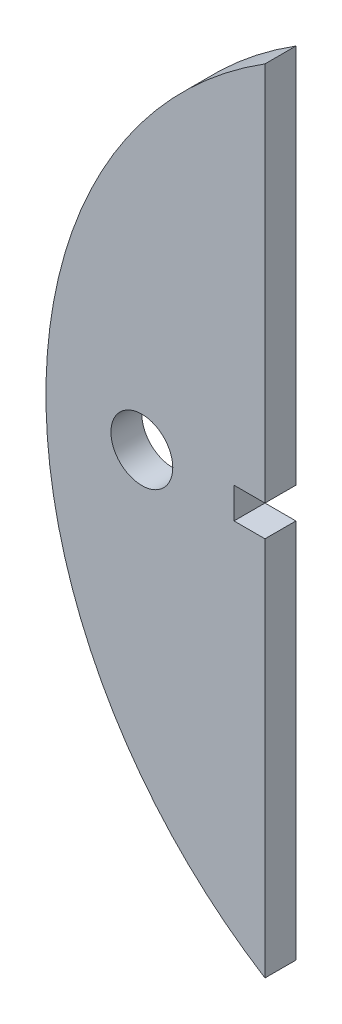
ISO-10303-21;
HEADER;
FILE_DESCRIPTION(('STEP AP214'),'2;1');
FILE_NAME('part.step','',(''),(''),'','','');
FILE_SCHEMA(('AUTOMOTIVE_DESIGN { 1 0 10303 214 1 1 1 1 }'));
ENDSEC;
DATA;
#1=APPLICATION_CONTEXT('core data for automotive mechanical design processes');
#2=APPLICATION_PROTOCOL_DEFINITION('international standard','automotive_design',2000,#1);
#3=PRODUCT_CONTEXT('',#1,'mechanical');
#4=PRODUCT('Part','Part','',(#3));
#5=PRODUCT_RELATED_PRODUCT_CATEGORY('part','',(#4));
#6=PRODUCT_DEFINITION_FORMATION('','',#4);
#7=PRODUCT_DEFINITION_CONTEXT('part definition',#1,'design');
#8=PRODUCT_DEFINITION('design','',#6,#7);
#9=PRODUCT_DEFINITION_SHAPE('','',#8);
#10=(LENGTH_UNIT() NAMED_UNIT(*) SI_UNIT(.MILLI.,.METRE.));
#11=(NAMED_UNIT(*) PLANE_ANGLE_UNIT() SI_UNIT($,.RADIAN.));
#12=(NAMED_UNIT(*) SI_UNIT($,.STERADIAN.) SOLID_ANGLE_UNIT());
#13=UNCERTAINTY_MEASURE_WITH_UNIT(LENGTH_MEASURE(1.E-05),#10,'distance_accuracy_value','');
#14=(GEOMETRIC_REPRESENTATION_CONTEXT(3) GLOBAL_UNCERTAINTY_ASSIGNED_CONTEXT((#13)) GLOBAL_UNIT_ASSIGNED_CONTEXT((#10,
#11,#12)) REPRESENTATION_CONTEXT('',''));
#15=CARTESIAN_POINT('',(0.,0.,0.));
#16=DIRECTION('',(0.,0.,1.));
#17=DIRECTION('',(1.,0.,0.));
#18=AXIS2_PLACEMENT_3D('',#15,#16,#17);
#19=CARTESIAN_POINT('',(0.,0.,3.175));
#20=DIRECTION('',(0.,0.,1.));
#21=DIRECTION('',(1.,0.,0.));
#22=AXIS2_PLACEMENT_3D('',#19,#20,#21);
#23=PLANE('',#22);
#24=DIRECTION('',(0.,1.,0.));
#25=VECTOR('',#24,1.);
#26=CARTESIAN_POINT('',(-28.6385,1.5875,3.175));
#27=LINE('',#26,#25);
#28=CARTESIAN_POINT('',(-28.6385,-1.58749999999999,3.175));
#29=VERTEX_POINT('',#28);
#30=CARTESIAN_POINT('',(-28.6385,1.5875,3.175));
#31=VERTEX_POINT('',#30);
#32=EDGE_CURVE('E128',#29,#31,#27,.T.);
#33=ORIENTED_EDGE('',*,*,#32,.T.);
#34=DIRECTION('',(1.,0.,0.));
#35=VECTOR('',#34,1.);
#36=CARTESIAN_POINT('',(-28.6385,1.5875,3.175));
#37=LINE('',#36,#35);
#38=CARTESIAN_POINT('',(-25.4635,1.5875,3.175));
#39=VERTEX_POINT('',#38);
#40=EDGE_CURVE('E86',#31,#39,#37,.T.);
#41=ORIENTED_EDGE('',*,*,#40,.T.);
#42=DIRECTION('',(0.,1.,0.));
#43=VECTOR('',#42,1.);
#44=CARTESIAN_POINT('',(-25.4635,1.5875,3.175));
#45=LINE('',#44,#43);
#46=CARTESIAN_POINT('',(-25.4635,40.6213425922876,3.175));
#47=VERTEX_POINT('',#46);
#48=EDGE_CURVE('E99',#39,#47,#45,.T.);
#49=ORIENTED_EDGE('',*,*,#48,.T.);
#50=CARTESIAN_POINT('',(0.,0.,3.175));
#51=DIRECTION('',(0.,0.,1.));
#52=DIRECTION('',(1.,0.,0.));
#53=AXIS2_PLACEMENT_3D('',#50,#51,#52);
#54=CIRCLE('',#53,47.9425);
#55=CARTESIAN_POINT('',(-25.4635,-40.6213425922876,3.175));
#56=VERTEX_POINT('',#55);
#57=EDGE_CURVE('E93',#47,#56,#54,.T.);
#58=ORIENTED_EDGE('',*,*,#57,.T.);
#59=DIRECTION('',(0.,1.,0.));
#60=VECTOR('',#59,1.);
#61=CARTESIAN_POINT('',(-25.4635,-1.5875,3.175));
#62=LINE('',#61,#60);
#63=CARTESIAN_POINT('',(-25.4635,-1.5875,3.175));
#64=VERTEX_POINT('',#63);
#65=EDGE_CURVE('E97',#56,#64,#62,.T.);
#66=ORIENTED_EDGE('',*,*,#65,.T.);
#67=DIRECTION('',(-1.,0.,0.));
#68=VECTOR('',#67,1.);
#69=CARTESIAN_POINT('',(-28.6385,-1.58749999999999,3.175));
#70=LINE('',#69,#68);
#71=EDGE_CURVE('E49',#64,#29,#70,.T.);
#72=ORIENTED_EDGE('',*,*,#71,.T.);
#73=EDGE_LOOP('',(#33,#41,#49,#58,#66,#72));
#74=FACE_BOUND('',#73,.T.);
#75=CARTESIAN_POINT('',(-38.1,0.,3.175));
#76=DIRECTION('',(0.,0.,1.));
#77=DIRECTION('',(1.,0.,0.));
#78=AXIS2_PLACEMENT_3D('',#75,#76,#77);
#79=CIRCLE('',#78,3.175);
#80=CARTESIAN_POINT('',(-34.925,0.,3.175));
#81=VERTEX_POINT('',#80);
#82=EDGE_CURVE('E121',#81,#81,#79,.T.);
#83=ORIENTED_EDGE('',*,*,#82,.F.);
#84=EDGE_LOOP('',(#83));
#85=FACE_BOUND('',#84,.T.);
#86=ADVANCED_FACE('F32',(#74,#85),#23,.T.);
#87=CARTESIAN_POINT('',(0.,0.,0.));
#88=DIRECTION('',(0.,0.,1.));
#89=DIRECTION('',(1.,0.,0.));
#90=AXIS2_PLACEMENT_3D('',#87,#88,#89);
#91=PLANE('',#90);
#92=DIRECTION('',(0.,1.,0.));
#93=VECTOR('',#92,1.);
#94=CARTESIAN_POINT('',(-28.6385,1.5875,0.));
#95=LINE('',#94,#93);
#96=CARTESIAN_POINT('',(-28.6385,-1.58749999999999,0.));
#97=VERTEX_POINT('',#96);
#98=CARTESIAN_POINT('',(-28.6385,1.5875,0.));
#99=VERTEX_POINT('',#98);
#100=EDGE_CURVE('E117',#97,#99,#95,.T.);
#101=ORIENTED_EDGE('',*,*,#100,.F.);
#102=DIRECTION('',(-1.,0.,0.));
#103=VECTOR('',#102,1.);
#104=CARTESIAN_POINT('',(-28.6385,-1.58749999999999,0.));
#105=LINE('',#104,#103);
#106=CARTESIAN_POINT('',(-25.4635,-1.5875,0.));
#107=VERTEX_POINT('',#106);
#108=EDGE_CURVE('E78',#107,#97,#105,.T.);
#109=ORIENTED_EDGE('',*,*,#108,.F.);
#110=DIRECTION('',(0.,1.,0.));
#111=VECTOR('',#110,1.);
#112=CARTESIAN_POINT('',(-25.4635,-1.5875,0.));
#113=LINE('',#112,#111);
#114=CARTESIAN_POINT('',(-25.4635,-40.6213425922876,0.));
#115=VERTEX_POINT('',#114);
#116=EDGE_CURVE('E72',#115,#107,#113,.T.);
#117=ORIENTED_EDGE('',*,*,#116,.F.);
#118=CARTESIAN_POINT('',(0.,0.,0.));
#119=DIRECTION('',(0.,0.,1.));
#120=DIRECTION('',(1.,0.,0.));
#121=AXIS2_PLACEMENT_3D('',#118,#119,#120);
#122=CIRCLE('',#121,47.9425);
#123=CARTESIAN_POINT('',(-25.4635,40.6213425922876,0.));
#124=VERTEX_POINT('',#123);
#125=EDGE_CURVE('E107',#124,#115,#122,.T.);
#126=ORIENTED_EDGE('',*,*,#125,.F.);
#127=DIRECTION('',(0.,1.,0.));
#128=VECTOR('',#127,1.);
#129=CARTESIAN_POINT('',(-25.4635,1.5875,0.));
#130=LINE('',#129,#128);
#131=CARTESIAN_POINT('',(-25.4635,1.5875,0.));
#132=VERTEX_POINT('',#131);
#133=EDGE_CURVE('E123',#132,#124,#130,.T.);
#134=ORIENTED_EDGE('',*,*,#133,.F.);
#135=DIRECTION('',(1.,0.,0.));
#136=VECTOR('',#135,1.);
#137=CARTESIAN_POINT('',(-28.6385,1.5875,0.));
#138=LINE('',#137,#136);
#139=EDGE_CURVE('E120',#99,#132,#138,.T.);
#140=ORIENTED_EDGE('',*,*,#139,.F.);
#141=EDGE_LOOP('',(#101,#109,#117,#126,#134,#140));
#142=FACE_BOUND('',#141,.T.);
#143=CARTESIAN_POINT('',(-38.1,0.,0.));
#144=DIRECTION('',(0.,0.,1.));
#145=DIRECTION('',(1.,0.,0.));
#146=AXIS2_PLACEMENT_3D('',#143,#144,#145);
#147=CIRCLE('',#146,3.175);
#148=CARTESIAN_POINT('',(-34.925,0.,0.));
#149=VERTEX_POINT('',#148);
#150=EDGE_CURVE('E221',#149,#149,#147,.T.);
#151=ORIENTED_EDGE('',*,*,#150,.T.);
#152=EDGE_LOOP('',(#151));
#153=FACE_BOUND('',#152,.T.);
#154=ADVANCED_FACE('F137',(#142,#153),#91,.F.);
#155=CARTESIAN_POINT('',(-28.6385,1.5875,3.175));
#156=DIRECTION('',(-1.,0.,0.));
#157=DIRECTION('',(0.,0.,1.));
#158=AXIS2_PLACEMENT_3D('',#155,#156,#157);
#159=PLANE('',#158);
#160=ORIENTED_EDGE('',*,*,#100,.T.);
#161=DIRECTION('',(0.,0.,-1.));
#162=VECTOR('',#161,1.);
#163=CARTESIAN_POINT('',(-28.6385,1.5875,3.175));
#164=LINE('',#163,#162);
#165=EDGE_CURVE('E11',#31,#99,#164,.T.);
#166=ORIENTED_EDGE('',*,*,#165,.F.);
#167=ORIENTED_EDGE('',*,*,#32,.F.);
#168=DIRECTION('',(0.,0.,-1.));
#169=VECTOR('',#168,1.);
#170=CARTESIAN_POINT('',(-28.6385,-1.58749999999999,3.175));
#171=LINE('',#170,#169);
#172=EDGE_CURVE('E113',#29,#97,#171,.T.);
#173=ORIENTED_EDGE('',*,*,#172,.T.);
#174=EDGE_LOOP('',(#160,#166,#167,#173));
#175=FACE_BOUND('',#174,.T.);
#176=ADVANCED_FACE('F34',(#175),#159,.F.);
#177=CARTESIAN_POINT('',(-28.6385,1.5875,3.175));
#178=DIRECTION('',(0.,1.,0.));
#179=DIRECTION('',(-1.,0.,0.));
#180=AXIS2_PLACEMENT_3D('',#177,#178,#179);
#181=PLANE('',#180);
#182=ORIENTED_EDGE('',*,*,#139,.T.);
#183=DIRECTION('',(0.,0.,-1.));
#184=VECTOR('',#183,1.);
#185=CARTESIAN_POINT('',(-25.4635,1.5875,3.175));
#186=LINE('',#185,#184);
#187=EDGE_CURVE('E41',#39,#132,#186,.T.);
#188=ORIENTED_EDGE('',*,*,#187,.F.);
#189=ORIENTED_EDGE('',*,*,#40,.F.);
#190=ORIENTED_EDGE('',*,*,#165,.T.);
#191=EDGE_LOOP('',(#182,#188,#189,#190));
#192=FACE_BOUND('',#191,.T.);
#193=ADVANCED_FACE('F162',(#192),#181,.F.);
#194=CARTESIAN_POINT('',(-25.4635,1.5875,3.175));
#195=DIRECTION('',(-1.,0.,0.));
#196=DIRECTION('',(0.,0.,1.));
#197=AXIS2_PLACEMENT_3D('',#194,#195,#196);
#198=PLANE('',#197);
#199=ORIENTED_EDGE('',*,*,#133,.T.);
#200=DIRECTION('',(0.,0.,-1.));
#201=VECTOR('',#200,1.);
#202=CARTESIAN_POINT('',(-25.4635,40.6213425922876,3.175));
#203=LINE('',#202,#201);
#204=EDGE_CURVE('E108',#47,#124,#203,.T.);
#205=ORIENTED_EDGE('',*,*,#204,.F.);
#206=ORIENTED_EDGE('',*,*,#48,.F.);
#207=ORIENTED_EDGE('',*,*,#187,.T.);
#208=EDGE_LOOP('',(#199,#205,#206,#207));
#209=FACE_BOUND('',#208,.T.);
#210=ADVANCED_FACE('F134',(#209),#198,.F.);
#211=CARTESIAN_POINT('',(0.,0.,3.175));
#212=DIRECTION('',(0.,0.,-1.));
#213=DIRECTION('',(-1.,0.,0.));
#214=AXIS2_PLACEMENT_3D('',#211,#212,#213);
#215=CYLINDRICAL_SURFACE('',#214,47.9425);
#216=ORIENTED_EDGE('',*,*,#125,.T.);
#217=DIRECTION('',(0.,0.,-1.));
#218=VECTOR('',#217,1.);
#219=CARTESIAN_POINT('',(-25.4635,-40.6213425922876,3.175));
#220=LINE('',#219,#218);
#221=EDGE_CURVE('E104',#56,#115,#220,.T.);
#222=ORIENTED_EDGE('',*,*,#221,.F.);
#223=ORIENTED_EDGE('',*,*,#57,.F.);
#224=ORIENTED_EDGE('',*,*,#204,.T.);
#225=EDGE_LOOP('',(#216,#222,#223,#224));
#226=FACE_BOUND('',#225,.T.);
#227=ADVANCED_FACE('F105',(#226),#215,.T.);
#228=CARTESIAN_POINT('',(-25.4635,-1.5875,3.175));
#229=DIRECTION('',(-1.,0.,0.));
#230=DIRECTION('',(0.,0.,1.));
#231=AXIS2_PLACEMENT_3D('',#228,#229,#230);
#232=PLANE('',#231);
#233=ORIENTED_EDGE('',*,*,#116,.T.);
#234=DIRECTION('',(0.,0.,-1.));
#235=VECTOR('',#234,1.);
#236=CARTESIAN_POINT('',(-25.4635,-1.5875,3.175));
#237=LINE('',#236,#235);
#238=EDGE_CURVE('E109',#64,#107,#237,.T.);
#239=ORIENTED_EDGE('',*,*,#238,.F.);
#240=ORIENTED_EDGE('',*,*,#65,.F.);
#241=ORIENTED_EDGE('',*,*,#221,.T.);
#242=EDGE_LOOP('',(#233,#239,#240,#241));
#243=FACE_BOUND('',#242,.T.);
#244=ADVANCED_FACE('F111',(#243),#232,.F.);
#245=CARTESIAN_POINT('',(-28.6385,-1.58749999999999,3.175));
#246=DIRECTION('',(0.,-1.,0.));
#247=DIRECTION('',(1.,0.,0.));
#248=AXIS2_PLACEMENT_3D('',#245,#246,#247);
#249=PLANE('',#248);
#250=ORIENTED_EDGE('',*,*,#108,.T.);
#251=ORIENTED_EDGE('',*,*,#172,.F.);
#252=ORIENTED_EDGE('',*,*,#71,.F.);
#253=ORIENTED_EDGE('',*,*,#238,.T.);
#254=EDGE_LOOP('',(#250,#251,#252,#253));
#255=FACE_BOUND('',#254,.T.);
#256=ADVANCED_FACE('F142',(#255),#249,.F.);
#257=CARTESIAN_POINT('',(-38.1,0.,3.175));
#258=DIRECTION('',(0.,0.,-1.));
#259=DIRECTION('',(-1.,0.,0.));
#260=AXIS2_PLACEMENT_3D('',#257,#258,#259);
#261=CYLINDRICAL_SURFACE('',#260,3.175);
#262=ORIENTED_EDGE('',*,*,#82,.T.);
#263=EDGE_LOOP('',(#262));
#264=FACE_BOUND('',#263,.T.);
#265=ORIENTED_EDGE('',*,*,#150,.F.);
#266=EDGE_LOOP('',(#265));
#267=FACE_BOUND('',#266,.T.);
#268=ADVANCED_FACE('F144',(#264,#267),#261,.F.);
#269=CLOSED_SHELL('',(#86,#154,#176,#193,#210,#227,#244,#256,#268));
#270=MANIFOLD_SOLID_BREP('B2',#269);
#271=ADVANCED_BREP_SHAPE_REPRESENTATION('',(#18,#270),#14);
#272=SHAPE_DEFINITION_REPRESENTATION(#9,#271);
ENDSEC;
END-ISO-10303-21;
